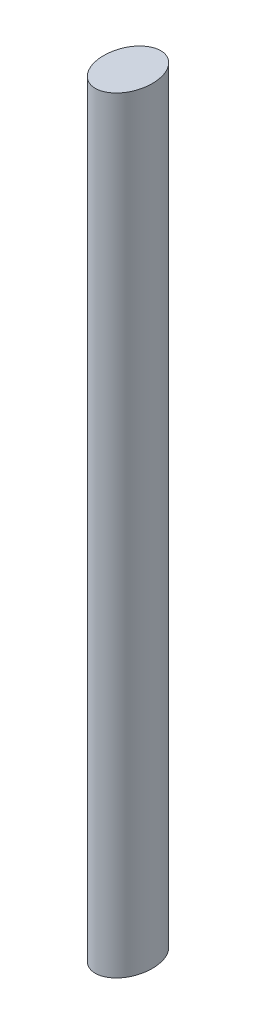
ISO-10303-21;
HEADER;
FILE_DESCRIPTION(('STEP AP214'),'2;1');
FILE_NAME('part.step','',(''),(''),'','','');
FILE_SCHEMA(('AUTOMOTIVE_DESIGN { 1 0 10303 214 1 1 1 1 }'));
ENDSEC;
DATA;
#1=APPLICATION_CONTEXT('core data for automotive mechanical design processes');
#2=APPLICATION_PROTOCOL_DEFINITION('international standard','automotive_design',2000,#1);
#3=PRODUCT_CONTEXT('',#1,'mechanical');
#4=PRODUCT('Part','Part','',(#3));
#5=PRODUCT_RELATED_PRODUCT_CATEGORY('part','',(#4));
#6=PRODUCT_DEFINITION_FORMATION('','',#4);
#7=PRODUCT_DEFINITION_CONTEXT('part definition',#1,'design');
#8=PRODUCT_DEFINITION('design','',#6,#7);
#9=PRODUCT_DEFINITION_SHAPE('','',#8);
#10=(LENGTH_UNIT() NAMED_UNIT(*) SI_UNIT(.MILLI.,.METRE.));
#11=(NAMED_UNIT(*) PLANE_ANGLE_UNIT() SI_UNIT($,.RADIAN.));
#12=(NAMED_UNIT(*) SI_UNIT($,.STERADIAN.) SOLID_ANGLE_UNIT());
#13=UNCERTAINTY_MEASURE_WITH_UNIT(LENGTH_MEASURE(1.E-05),#10,'distance_accuracy_value','');
#14=(GEOMETRIC_REPRESENTATION_CONTEXT(3) GLOBAL_UNCERTAINTY_ASSIGNED_CONTEXT((#13)) GLOBAL_UNIT_ASSIGNED_CONTEXT((#10,
#11,#12)) REPRESENTATION_CONTEXT('',''));
#15=CARTESIAN_POINT('',(0.,0.,0.));
#16=DIRECTION('',(0.,0.,1.));
#17=DIRECTION('',(1.,0.,0.));
#18=AXIS2_PLACEMENT_3D('',#15,#16,#17);
#19=CARTESIAN_POINT('',(0.,75.,0.));
#20=DIRECTION('',(0.,1.,0.));
#21=DIRECTION('',(0.,0.,-1.));
#22=AXIS2_PLACEMENT_3D('',#19,#20,#21);
#23=ELLIPSE('',#22,3.2,2.375);
#24=DIRECTION('',(0.,-1.,0.));
#25=VECTOR('',#24,1.);
#26=SURFACE_OF_LINEAR_EXTRUSION('',#23,#25);
#27=CARTESIAN_POINT('',(0.,75.,-3.2));
#28=VERTEX_POINT('',#27);
#29=EDGE_CURVE('E10',#28,#28,#23,.T.);
#30=ORIENTED_EDGE('',*,*,#29,.F.);
#31=EDGE_LOOP('',(#30));
#32=FACE_BOUND('',#31,.T.);
#33=CARTESIAN_POINT('',(0.,0.,0.));
#34=DIRECTION('',(0.,1.,0.));
#35=DIRECTION('',(0.,0.,-1.));
#36=AXIS2_PLACEMENT_3D('',#33,#34,#35);
#37=ELLIPSE('',#36,3.2,2.375);
#38=CARTESIAN_POINT('',(0.,0.,-3.2));
#39=VERTEX_POINT('',#38);
#40=EDGE_CURVE('E36',#39,#39,#37,.T.);
#41=ORIENTED_EDGE('',*,*,#40,.T.);
#42=EDGE_LOOP('',(#41));
#43=FACE_BOUND('',#42,.T.);
#44=ADVANCED_FACE('F32',(#32,#43),#26,.F.);
#45=CARTESIAN_POINT('',(0.,75.,0.));
#46=DIRECTION('',(0.,1.,0.));
#47=DIRECTION('',(0.,0.,1.));
#48=AXIS2_PLACEMENT_3D('',#45,#46,#47);
#49=PLANE('',#48);
#50=ORIENTED_EDGE('',*,*,#29,.T.);
#51=EDGE_LOOP('',(#50));
#52=FACE_BOUND('',#51,.T.);
#53=ADVANCED_FACE('F48',(#52),#49,.T.);
#54=CARTESIAN_POINT('',(0.,0.,0.));
#55=DIRECTION('',(0.,1.,0.));
#56=DIRECTION('',(0.,0.,1.));
#57=AXIS2_PLACEMENT_3D('',#54,#55,#56);
#58=PLANE('',#57);
#59=ORIENTED_EDGE('',*,*,#40,.F.);
#60=EDGE_LOOP('',(#59));
#61=FACE_BOUND('',#60,.T.);
#62=ADVANCED_FACE('F46',(#61),#58,.F.);
#63=CLOSED_SHELL('',(#44,#53,#62));
#64=MANIFOLD_SOLID_BREP('B2',#63);
#65=ADVANCED_BREP_SHAPE_REPRESENTATION('',(#18,#64),#14);
#66=SHAPE_DEFINITION_REPRESENTATION(#9,#65);
ENDSEC;
END-ISO-10303-21;
